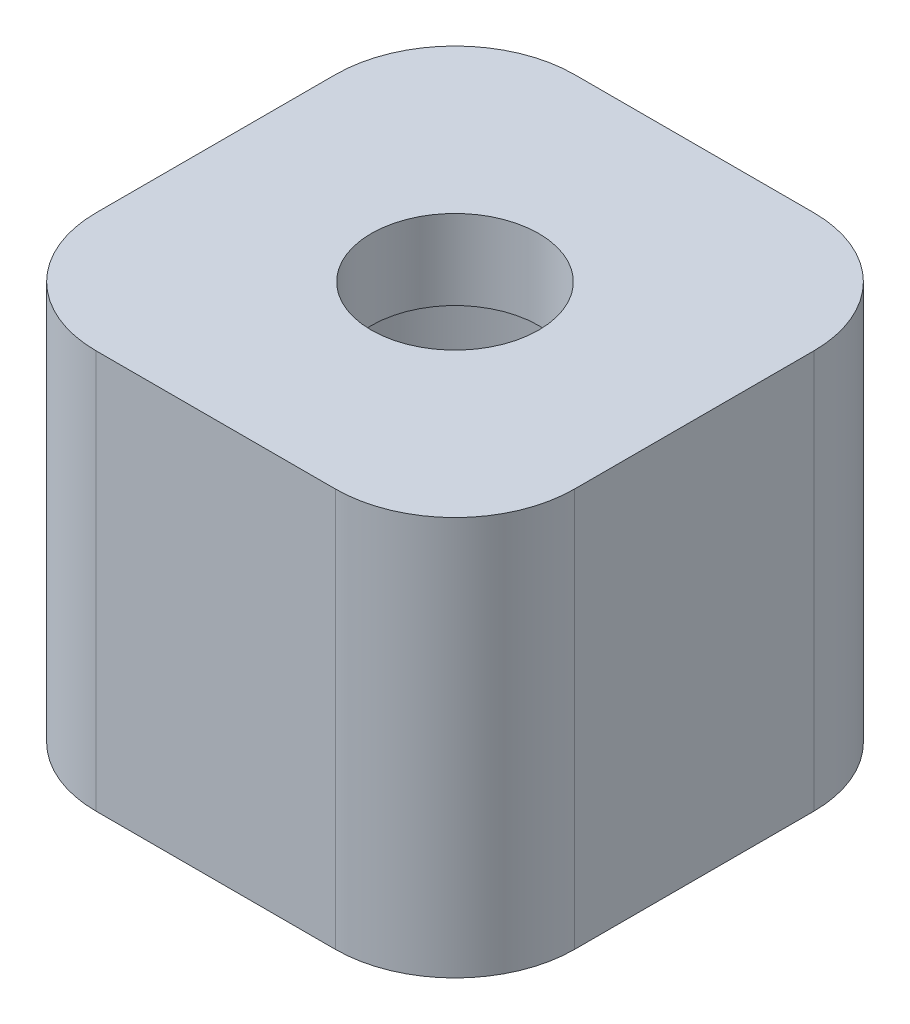
ISO-10303-21;
HEADER;
FILE_DESCRIPTION(('STEP AP214'),'2;1');
FILE_NAME('part.step','',(''),(''),'','','');
FILE_SCHEMA(('AUTOMOTIVE_DESIGN { 1 0 10303 214 1 1 1 1 }'));
ENDSEC;
DATA;
#1=APPLICATION_CONTEXT('core data for automotive mechanical design processes');
#2=APPLICATION_PROTOCOL_DEFINITION('international standard','automotive_design',2000,#1);
#3=PRODUCT_CONTEXT('',#1,'mechanical');
#4=PRODUCT('Part','Part','',(#3));
#5=PRODUCT_RELATED_PRODUCT_CATEGORY('part','',(#4));
#6=PRODUCT_DEFINITION_FORMATION('','',#4);
#7=PRODUCT_DEFINITION_CONTEXT('part definition',#1,'design');
#8=PRODUCT_DEFINITION('design','',#6,#7);
#9=PRODUCT_DEFINITION_SHAPE('','',#8);
#10=(LENGTH_UNIT() NAMED_UNIT(*) SI_UNIT(.MILLI.,.METRE.));
#11=(NAMED_UNIT(*) PLANE_ANGLE_UNIT() SI_UNIT($,.RADIAN.));
#12=(NAMED_UNIT(*) SI_UNIT($,.STERADIAN.) SOLID_ANGLE_UNIT());
#13=UNCERTAINTY_MEASURE_WITH_UNIT(LENGTH_MEASURE(1.E-05),#10,'distance_accuracy_value','');
#14=(GEOMETRIC_REPRESENTATION_CONTEXT(3) GLOBAL_UNCERTAINTY_ASSIGNED_CONTEXT((#13)) GLOBAL_UNIT_ASSIGNED_CONTEXT((#10,
#11,#12)) REPRESENTATION_CONTEXT('',''));
#15=CARTESIAN_POINT('',(0.,0.,0.));
#16=DIRECTION('',(0.,0.,1.));
#17=DIRECTION('',(1.,0.,0.));
#18=AXIS2_PLACEMENT_3D('',#15,#16,#17);
#19=CARTESIAN_POINT('',(0.,10.,0.));
#20=DIRECTION('',(0.,-1.,0.));
#21=DIRECTION('',(0.,0.,-1.));
#22=AXIS2_PLACEMENT_3D('',#19,#20,#21);
#23=CYLINDRICAL_SURFACE('',#22,2.1);
#24=CARTESIAN_POINT('',(0.,10.,0.));
#25=DIRECTION('',(0.,1.,0.));
#26=DIRECTION('',(0.,0.,1.));
#27=AXIS2_PLACEMENT_3D('',#24,#25,#26);
#28=CIRCLE('',#27,2.1);
#29=CARTESIAN_POINT('',(0.,10.,2.1));
#30=VERTEX_POINT('',#29);
#31=EDGE_CURVE('E144',#30,#30,#28,.T.);
#32=ORIENTED_EDGE('',*,*,#31,.T.);
#33=EDGE_LOOP('',(#32));
#34=FACE_BOUND('',#33,.T.);
#35=CARTESIAN_POINT('',(0.,8.,0.));
#36=DIRECTION('',(0.,-1.,0.));
#37=DIRECTION('',(0.,0.,-1.));
#38=AXIS2_PLACEMENT_3D('',#35,#36,#37);
#39=CIRCLE('',#38,2.1);
#40=CARTESIAN_POINT('',(0.,8.,-2.1));
#41=VERTEX_POINT('',#40);
#42=EDGE_CURVE('E45',#41,#41,#39,.T.);
#43=ORIENTED_EDGE('',*,*,#42,.T.);
#44=EDGE_LOOP('',(#43));
#45=FACE_BOUND('',#44,.T.);
#46=ADVANCED_FACE('F41',(#34,#45),#23,.F.);
#47=CARTESIAN_POINT('',(3.,10.,3.));
#48=DIRECTION('',(0.,-1.,0.));
#49=DIRECTION('',(0.,0.,-1.));
#50=AXIS2_PLACEMENT_3D('',#47,#48,#49);
#51=PLANE('',#50);
#52=CARTESIAN_POINT('',(3.,10.,3.));
#53=DIRECTION('',(0.,1.,0.));
#54=DIRECTION('',(0.,0.,-1.));
#55=AXIS2_PLACEMENT_3D('',#52,#53,#54);
#56=CIRCLE('',#55,3.);
#57=CARTESIAN_POINT('',(2.99999999999998,10.,6.));
#58=VERTEX_POINT('',#57);
#59=CARTESIAN_POINT('',(6.,10.,2.99999999999998));
#60=VERTEX_POINT('',#59);
#61=EDGE_CURVE('E155',#58,#60,#56,.T.);
#62=ORIENTED_EDGE('',*,*,#61,.T.);
#63=DIRECTION('',(0.,0.,-1.));
#64=VECTOR('',#63,1.);
#65=CARTESIAN_POINT('',(6.,10.,2.99999999999998));
#66=LINE('',#65,#64);
#67=CARTESIAN_POINT('',(6.,10.,-2.99999999999998));
#68=VERTEX_POINT('',#67);
#69=EDGE_CURVE('E102',#60,#68,#66,.T.);
#70=ORIENTED_EDGE('',*,*,#69,.T.);
#71=CARTESIAN_POINT('',(3.,10.,-3.));
#72=DIRECTION('',(0.,1.,0.));
#73=DIRECTION('',(0.,0.,-1.));
#74=AXIS2_PLACEMENT_3D('',#71,#72,#73);
#75=CIRCLE('',#74,3.);
#76=CARTESIAN_POINT('',(2.99999999999998,10.,-6.));
#77=VERTEX_POINT('',#76);
#78=EDGE_CURVE('E171',#68,#77,#75,.T.);
#79=ORIENTED_EDGE('',*,*,#78,.T.);
#80=DIRECTION('',(-1.,0.,0.));
#81=VECTOR('',#80,1.);
#82=CARTESIAN_POINT('',(-2.99999999999998,10.,-6.));
#83=LINE('',#82,#81);
#84=CARTESIAN_POINT('',(-2.99999999999998,10.,-6.));
#85=VERTEX_POINT('',#84);
#86=EDGE_CURVE('E183',#77,#85,#83,.T.);
#87=ORIENTED_EDGE('',*,*,#86,.T.);
#88=CARTESIAN_POINT('',(-3.,10.,-3.));
#89=DIRECTION('',(0.,1.,0.));
#90=DIRECTION('',(0.,0.,-1.));
#91=AXIS2_PLACEMENT_3D('',#88,#89,#90);
#92=CIRCLE('',#91,3.);
#93=CARTESIAN_POINT('',(-6.,10.,-2.99999999999998));
#94=VERTEX_POINT('',#93);
#95=EDGE_CURVE('E122',#85,#94,#92,.T.);
#96=ORIENTED_EDGE('',*,*,#95,.T.);
#97=DIRECTION('',(0.,0.,1.));
#98=VECTOR('',#97,1.);
#99=CARTESIAN_POINT('',(-6.,10.,2.99999999999998));
#100=LINE('',#99,#98);
#101=CARTESIAN_POINT('',(-6.,10.,2.99999999999998));
#102=VERTEX_POINT('',#101);
#103=EDGE_CURVE('E115',#94,#102,#100,.T.);
#104=ORIENTED_EDGE('',*,*,#103,.T.);
#105=CARTESIAN_POINT('',(-3.,10.,3.));
#106=DIRECTION('',(0.,1.,0.));
#107=DIRECTION('',(0.,0.,-1.));
#108=AXIS2_PLACEMENT_3D('',#105,#106,#107);
#109=CIRCLE('',#108,3.);
#110=CARTESIAN_POINT('',(-2.99999999999998,10.,6.));
#111=VERTEX_POINT('',#110);
#112=EDGE_CURVE('E120',#102,#111,#109,.T.);
#113=ORIENTED_EDGE('',*,*,#112,.T.);
#114=DIRECTION('',(1.,0.,0.));
#115=VECTOR('',#114,1.);
#116=CARTESIAN_POINT('',(-2.99999999999998,10.,6.));
#117=LINE('',#116,#115);
#118=EDGE_CURVE('E59',#111,#58,#117,.T.);
#119=ORIENTED_EDGE('',*,*,#118,.T.);
#120=EDGE_LOOP('',(#62,#70,#79,#87,#96,#104,#113,#119));
#121=FACE_BOUND('',#120,.T.);
#122=ORIENTED_EDGE('',*,*,#31,.F.);
#123=EDGE_LOOP('',(#122));
#124=FACE_BOUND('',#123,.T.);
#125=ADVANCED_FACE('F117',(#121,#124),#51,.F.);
#126=CARTESIAN_POINT('',(3.,0.,3.));
#127=DIRECTION('',(0.,-1.,0.));
#128=DIRECTION('',(0.,0.,-1.));
#129=AXIS2_PLACEMENT_3D('',#126,#127,#128);
#130=PLANE('',#129);
#131=CARTESIAN_POINT('',(0.,0.,0.));
#132=DIRECTION('',(0.,-1.,0.));
#133=DIRECTION('',(0.,0.,-1.));
#134=AXIS2_PLACEMENT_3D('',#131,#132,#133);
#135=CIRCLE('',#134,4.4);
#136=CARTESIAN_POINT('',(0.,0.,-4.4));
#137=VERTEX_POINT('',#136);
#138=EDGE_CURVE('E191',#137,#137,#135,.T.);
#139=ORIENTED_EDGE('',*,*,#138,.F.);
#140=EDGE_LOOP('',(#139));
#141=FACE_BOUND('',#140,.T.);
#142=CARTESIAN_POINT('',(3.,0.,3.));
#143=DIRECTION('',(0.,1.,0.));
#144=DIRECTION('',(0.,0.,-1.));
#145=AXIS2_PLACEMENT_3D('',#142,#143,#144);
#146=CIRCLE('',#145,3.);
#147=CARTESIAN_POINT('',(2.99999999999998,0.,6.));
#148=VERTEX_POINT('',#147);
#149=CARTESIAN_POINT('',(6.,0.,2.99999999999998));
#150=VERTEX_POINT('',#149);
#151=EDGE_CURVE('E140',#148,#150,#146,.T.);
#152=ORIENTED_EDGE('',*,*,#151,.F.);
#153=DIRECTION('',(1.,0.,0.));
#154=VECTOR('',#153,1.);
#155=CARTESIAN_POINT('',(-2.99999999999998,0.,6.));
#156=LINE('',#155,#154);
#157=CARTESIAN_POINT('',(-2.99999999999998,0.,6.));
#158=VERTEX_POINT('',#157);
#159=EDGE_CURVE('E94',#158,#148,#156,.T.);
#160=ORIENTED_EDGE('',*,*,#159,.F.);
#161=CARTESIAN_POINT('',(-3.,0.,3.));
#162=DIRECTION('',(0.,1.,0.));
#163=DIRECTION('',(0.,0.,-1.));
#164=AXIS2_PLACEMENT_3D('',#161,#162,#163);
#165=CIRCLE('',#164,3.);
#166=CARTESIAN_POINT('',(-6.,0.,2.99999999999998));
#167=VERTEX_POINT('',#166);
#168=EDGE_CURVE('E88',#167,#158,#165,.T.);
#169=ORIENTED_EDGE('',*,*,#168,.F.);
#170=DIRECTION('',(0.,0.,1.));
#171=VECTOR('',#170,1.);
#172=CARTESIAN_POINT('',(-6.,0.,2.99999999999998));
#173=LINE('',#172,#171);
#174=CARTESIAN_POINT('',(-6.,0.,-2.99999999999998));
#175=VERTEX_POINT('',#174);
#176=EDGE_CURVE('E130',#175,#167,#173,.T.);
#177=ORIENTED_EDGE('',*,*,#176,.F.);
#178=CARTESIAN_POINT('',(-3.,0.,-3.));
#179=DIRECTION('',(0.,1.,0.));
#180=DIRECTION('',(0.,0.,-1.));
#181=AXIS2_PLACEMENT_3D('',#178,#179,#180);
#182=CIRCLE('',#181,3.);
#183=CARTESIAN_POINT('',(-2.99999999999998,0.,-6.));
#184=VERTEX_POINT('',#183);
#185=EDGE_CURVE('E150',#184,#175,#182,.T.);
#186=ORIENTED_EDGE('',*,*,#185,.F.);
#187=DIRECTION('',(-1.,0.,0.));
#188=VECTOR('',#187,1.);
#189=CARTESIAN_POINT('',(-2.99999999999998,0.,-6.));
#190=LINE('',#189,#188);
#191=CARTESIAN_POINT('',(2.99999999999998,0.,-6.));
#192=VERTEX_POINT('',#191);
#193=EDGE_CURVE('E148',#192,#184,#190,.T.);
#194=ORIENTED_EDGE('',*,*,#193,.F.);
#195=CARTESIAN_POINT('',(3.,0.,-3.));
#196=DIRECTION('',(0.,1.,0.));
#197=DIRECTION('',(0.,0.,-1.));
#198=AXIS2_PLACEMENT_3D('',#195,#196,#197);
#199=CIRCLE('',#198,3.);
#200=CARTESIAN_POINT('',(6.,0.,-2.99999999999998));
#201=VERTEX_POINT('',#200);
#202=EDGE_CURVE('E146',#201,#192,#199,.T.);
#203=ORIENTED_EDGE('',*,*,#202,.F.);
#204=DIRECTION('',(0.,0.,-1.));
#205=VECTOR('',#204,1.);
#206=CARTESIAN_POINT('',(6.,0.,2.99999999999998));
#207=LINE('',#206,#205);
#208=EDGE_CURVE('E143',#150,#201,#207,.T.);
#209=ORIENTED_EDGE('',*,*,#208,.F.);
#210=EDGE_LOOP('',(#152,#160,#169,#177,#186,#194,#203,#209));
#211=FACE_BOUND('',#210,.T.);
#212=ADVANCED_FACE('F175',(#141,#211),#130,.T.);
#213=CARTESIAN_POINT('',(3.,10.,3.));
#214=DIRECTION('',(0.,-1.,0.));
#215=DIRECTION('',(0.,0.,-1.));
#216=AXIS2_PLACEMENT_3D('',#213,#214,#215);
#217=CYLINDRICAL_SURFACE('',#216,3.);
#218=ORIENTED_EDGE('',*,*,#151,.T.);
#219=DIRECTION('',(0.,-1.,0.));
#220=VECTOR('',#219,1.);
#221=CARTESIAN_POINT('',(6.,10.,2.99999999999998));
#222=LINE('',#221,#220);
#223=EDGE_CURVE('E11',#60,#150,#222,.T.);
#224=ORIENTED_EDGE('',*,*,#223,.F.);
#225=ORIENTED_EDGE('',*,*,#61,.F.);
#226=DIRECTION('',(0.,-1.,0.));
#227=VECTOR('',#226,1.);
#228=CARTESIAN_POINT('',(2.99999999999998,10.,6.));
#229=LINE('',#228,#227);
#230=EDGE_CURVE('E136',#58,#148,#229,.T.);
#231=ORIENTED_EDGE('',*,*,#230,.T.);
#232=EDGE_LOOP('',(#218,#224,#225,#231));
#233=FACE_BOUND('',#232,.T.);
#234=ADVANCED_FACE('F43',(#233),#217,.T.);
#235=CARTESIAN_POINT('',(6.,10.,2.99999999999998));
#236=DIRECTION('',(-1.,0.,0.));
#237=DIRECTION('',(0.,0.,1.));
#238=AXIS2_PLACEMENT_3D('',#235,#236,#237);
#239=PLANE('',#238);
#240=ORIENTED_EDGE('',*,*,#208,.T.);
#241=DIRECTION('',(0.,-1.,0.));
#242=VECTOR('',#241,1.);
#243=CARTESIAN_POINT('',(6.,10.,-2.99999999999998));
#244=LINE('',#243,#242);
#245=EDGE_CURVE('E51',#68,#201,#244,.T.);
#246=ORIENTED_EDGE('',*,*,#245,.F.);
#247=ORIENTED_EDGE('',*,*,#69,.F.);
#248=ORIENTED_EDGE('',*,*,#223,.T.);
#249=EDGE_LOOP('',(#240,#246,#247,#248));
#250=FACE_BOUND('',#249,.T.);
#251=ADVANCED_FACE('F234',(#250),#239,.F.);
#252=CARTESIAN_POINT('',(3.,10.,-3.));
#253=DIRECTION('',(0.,-1.,0.));
#254=DIRECTION('',(0.,0.,-1.));
#255=AXIS2_PLACEMENT_3D('',#252,#253,#254);
#256=CYLINDRICAL_SURFACE('',#255,3.);
#257=ORIENTED_EDGE('',*,*,#202,.T.);
#258=DIRECTION('',(0.,-1.,0.));
#259=VECTOR('',#258,1.);
#260=CARTESIAN_POINT('',(2.99999999999998,10.,-6.));
#261=LINE('',#260,#259);
#262=EDGE_CURVE('E162',#77,#192,#261,.T.);
#263=ORIENTED_EDGE('',*,*,#262,.F.);
#264=ORIENTED_EDGE('',*,*,#78,.F.);
#265=ORIENTED_EDGE('',*,*,#245,.T.);
#266=EDGE_LOOP('',(#257,#263,#264,#265));
#267=FACE_BOUND('',#266,.T.);
#268=ADVANCED_FACE('F169',(#267),#256,.T.);
#269=CARTESIAN_POINT('',(-2.99999999999998,10.,-6.));
#270=DIRECTION('',(0.,0.,1.));
#271=DIRECTION('',(1.,0.,0.));
#272=AXIS2_PLACEMENT_3D('',#269,#270,#271);
#273=PLANE('',#272);
#274=ORIENTED_EDGE('',*,*,#193,.T.);
#275=DIRECTION('',(0.,-1.,0.));
#276=VECTOR('',#275,1.);
#277=CARTESIAN_POINT('',(-2.99999999999998,10.,-6.));
#278=LINE('',#277,#276);
#279=EDGE_CURVE('E159',#85,#184,#278,.T.);
#280=ORIENTED_EDGE('',*,*,#279,.F.);
#281=ORIENTED_EDGE('',*,*,#86,.F.);
#282=ORIENTED_EDGE('',*,*,#262,.T.);
#283=EDGE_LOOP('',(#274,#280,#281,#282));
#284=FACE_BOUND('',#283,.T.);
#285=ADVANCED_FACE('F179',(#284),#273,.F.);
#286=CARTESIAN_POINT('',(-3.,10.,-3.));
#287=DIRECTION('',(0.,-1.,0.));
#288=DIRECTION('',(0.,0.,-1.));
#289=AXIS2_PLACEMENT_3D('',#286,#287,#288);
#290=CYLINDRICAL_SURFACE('',#289,3.);
#291=ORIENTED_EDGE('',*,*,#185,.T.);
#292=DIRECTION('',(0.,-1.,0.));
#293=VECTOR('',#292,1.);
#294=CARTESIAN_POINT('',(-6.,10.,-2.99999999999998));
#295=LINE('',#294,#293);
#296=EDGE_CURVE('E131',#94,#175,#295,.T.);
#297=ORIENTED_EDGE('',*,*,#296,.F.);
#298=ORIENTED_EDGE('',*,*,#95,.F.);
#299=ORIENTED_EDGE('',*,*,#279,.T.);
#300=EDGE_LOOP('',(#291,#297,#298,#299));
#301=FACE_BOUND('',#300,.T.);
#302=ADVANCED_FACE('F182',(#301),#290,.T.);
#303=CARTESIAN_POINT('',(-6.,10.,2.99999999999998));
#304=DIRECTION('',(1.,0.,0.));
#305=DIRECTION('',(0.,0.,-1.));
#306=AXIS2_PLACEMENT_3D('',#303,#304,#305);
#307=PLANE('',#306);
#308=ORIENTED_EDGE('',*,*,#176,.T.);
#309=DIRECTION('',(0.,-1.,0.));
#310=VECTOR('',#309,1.);
#311=CARTESIAN_POINT('',(-6.,10.,2.99999999999998));
#312=LINE('',#311,#310);
#313=EDGE_CURVE('E127',#102,#167,#312,.T.);
#314=ORIENTED_EDGE('',*,*,#313,.F.);
#315=ORIENTED_EDGE('',*,*,#103,.F.);
#316=ORIENTED_EDGE('',*,*,#296,.T.);
#317=EDGE_LOOP('',(#308,#314,#315,#316));
#318=FACE_BOUND('',#317,.T.);
#319=ADVANCED_FACE('F128',(#318),#307,.F.);
#320=CARTESIAN_POINT('',(-3.,10.,3.));
#321=DIRECTION('',(0.,-1.,0.));
#322=DIRECTION('',(0.,0.,-1.));
#323=AXIS2_PLACEMENT_3D('',#320,#321,#322);
#324=CYLINDRICAL_SURFACE('',#323,3.);
#325=ORIENTED_EDGE('',*,*,#168,.T.);
#326=DIRECTION('',(0.,-1.,0.));
#327=VECTOR('',#326,1.);
#328=CARTESIAN_POINT('',(-2.99999999999998,10.,6.));
#329=LINE('',#328,#327);
#330=EDGE_CURVE('E132',#111,#158,#329,.T.);
#331=ORIENTED_EDGE('',*,*,#330,.F.);
#332=ORIENTED_EDGE('',*,*,#112,.F.);
#333=ORIENTED_EDGE('',*,*,#313,.T.);
#334=EDGE_LOOP('',(#325,#331,#332,#333));
#335=FACE_BOUND('',#334,.T.);
#336=ADVANCED_FACE('F134',(#335),#324,.T.);
#337=CARTESIAN_POINT('',(-2.99999999999998,10.,6.));
#338=DIRECTION('',(0.,0.,-1.));
#339=DIRECTION('',(-1.,0.,0.));
#340=AXIS2_PLACEMENT_3D('',#337,#338,#339);
#341=PLANE('',#340);
#342=ORIENTED_EDGE('',*,*,#159,.T.);
#343=ORIENTED_EDGE('',*,*,#230,.F.);
#344=ORIENTED_EDGE('',*,*,#118,.F.);
#345=ORIENTED_EDGE('',*,*,#330,.T.);
#346=EDGE_LOOP('',(#342,#343,#344,#345));
#347=FACE_BOUND('',#346,.T.);
#348=ADVANCED_FACE('F209',(#347),#341,.F.);
#349=CARTESIAN_POINT('',(0.,8.,0.));
#350=DIRECTION('',(0.,-1.,0.));
#351=DIRECTION('',(0.,0.,-1.));
#352=AXIS2_PLACEMENT_3D('',#349,#350,#351);
#353=CYLINDRICAL_SURFACE('',#352,4.4);
#354=CARTESIAN_POINT('',(0.,8.,0.));
#355=DIRECTION('',(0.,-1.,0.));
#356=DIRECTION('',(0.,0.,-1.));
#357=AXIS2_PLACEMENT_3D('',#354,#355,#356);
#358=CIRCLE('',#357,4.4);
#359=CARTESIAN_POINT('',(0.,8.,-4.4));
#360=VERTEX_POINT('',#359);
#361=EDGE_CURVE('E194',#360,#360,#358,.T.);
#362=ORIENTED_EDGE('',*,*,#361,.F.);
#363=EDGE_LOOP('',(#362));
#364=FACE_BOUND('',#363,.T.);
#365=ORIENTED_EDGE('',*,*,#138,.T.);
#366=EDGE_LOOP('',(#365));
#367=FACE_BOUND('',#366,.T.);
#368=ADVANCED_FACE('F204',(#364,#367),#353,.F.);
#369=CARTESIAN_POINT('',(0.,8.,0.));
#370=DIRECTION('',(0.,-1.,0.));
#371=DIRECTION('',(0.,0.,-1.));
#372=AXIS2_PLACEMENT_3D('',#369,#370,#371);
#373=PLANE('',#372);
#374=ORIENTED_EDGE('',*,*,#42,.F.);
#375=EDGE_LOOP('',(#374));
#376=FACE_BOUND('',#375,.T.);
#377=ORIENTED_EDGE('',*,*,#361,.T.);
#378=EDGE_LOOP('',(#377));
#379=FACE_BOUND('',#378,.T.);
#380=ADVANCED_FACE('F202',(#376,#379),#373,.T.);
#381=CLOSED_SHELL('',(#46,#125,#212,#234,#251,#268,#285,#302,#319,#336,#348,#368,#380));
#382=MANIFOLD_SOLID_BREP('B2',#381);
#383=ADVANCED_BREP_SHAPE_REPRESENTATION('',(#18,#382),#14);
#384=SHAPE_DEFINITION_REPRESENTATION(#9,#383);
ENDSEC;
END-ISO-10303-21;
